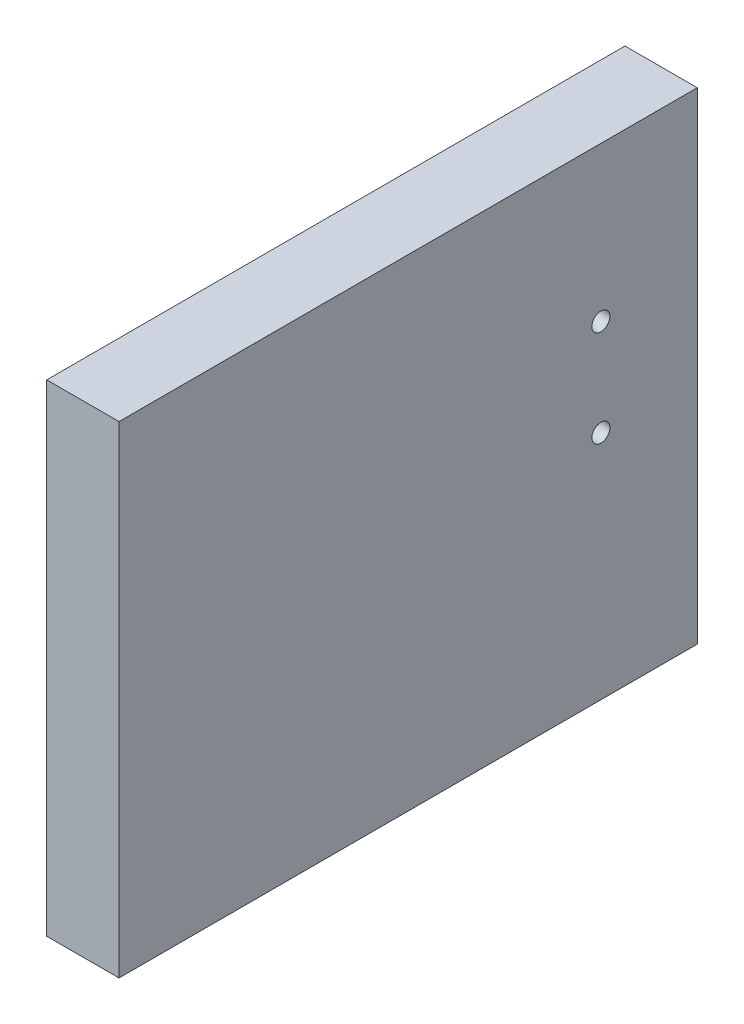
ISO-10303-21;
HEADER;
FILE_DESCRIPTION(('STEP AP214'),'2;1');
FILE_NAME('part.step','',(''),(''),'','','');
FILE_SCHEMA(('AUTOMOTIVE_DESIGN { 1 0 10303 214 1 1 1 1 }'));
ENDSEC;
DATA;
#1=APPLICATION_CONTEXT('core data for automotive mechanical design processes');
#2=APPLICATION_PROTOCOL_DEFINITION('international standard','automotive_design',2000,#1);
#3=PRODUCT_CONTEXT('',#1,'mechanical');
#4=PRODUCT('Part','Part','',(#3));
#5=PRODUCT_RELATED_PRODUCT_CATEGORY('part','',(#4));
#6=PRODUCT_DEFINITION_FORMATION('','',#4);
#7=PRODUCT_DEFINITION_CONTEXT('part definition',#1,'design');
#8=PRODUCT_DEFINITION('design','',#6,#7);
#9=PRODUCT_DEFINITION_SHAPE('','',#8);
#10=(LENGTH_UNIT() NAMED_UNIT(*) SI_UNIT(.MILLI.,.METRE.));
#11=(NAMED_UNIT(*) PLANE_ANGLE_UNIT() SI_UNIT($,.RADIAN.));
#12=(NAMED_UNIT(*) SI_UNIT($,.STERADIAN.) SOLID_ANGLE_UNIT());
#13=UNCERTAINTY_MEASURE_WITH_UNIT(LENGTH_MEASURE(1.E-05),#10,'distance_accuracy_value','');
#14=(GEOMETRIC_REPRESENTATION_CONTEXT(3) GLOBAL_UNCERTAINTY_ASSIGNED_CONTEXT((#13)) GLOBAL_UNIT_ASSIGNED_CONTEXT((#10,
#11,#12)) REPRESENTATION_CONTEXT('',''));
#15=CARTESIAN_POINT('',(0.,0.,0.));
#16=DIRECTION('',(0.,0.,1.));
#17=DIRECTION('',(1.,0.,0.));
#18=AXIS2_PLACEMENT_3D('',#15,#16,#17);
#19=CARTESIAN_POINT('',(9.52499999999999,63.5,152.4));
#20=DIRECTION('',(-1.,0.,0.));
#21=DIRECTION('',(0.,-1.,0.));
#22=AXIS2_PLACEMENT_3D('',#19,#20,#21);
#23=PLANE('',#22);
#24=CARTESIAN_POINT('',(9.525,-2.54,25.4));
#25=DIRECTION('',(1.,0.,0.));
#26=DIRECTION('',(0.,1.,0.));
#27=AXIS2_PLACEMENT_3D('',#24,#25,#26);
#28=CIRCLE('',#27,2.38125);
#29=CARTESIAN_POINT('',(9.525,-0.158750000000003,25.4));
#30=VERTEX_POINT('',#29);
#31=EDGE_CURVE('E117',#30,#30,#28,.T.);
#32=ORIENTED_EDGE('',*,*,#31,.F.);
#33=EDGE_LOOP('',(#32));
#34=FACE_BOUND('',#33,.T.);
#35=CARTESIAN_POINT('',(9.525,22.86,25.4));
#36=DIRECTION('',(1.,0.,0.));
#37=DIRECTION('',(0.,1.,0.));
#38=AXIS2_PLACEMENT_3D('',#35,#36,#37);
#39=CIRCLE('',#38,2.38125000000001);
#40=CARTESIAN_POINT('',(9.525,25.24125,25.4));
#41=VERTEX_POINT('',#40);
#42=EDGE_CURVE('E111',#41,#41,#39,.T.);
#43=ORIENTED_EDGE('',*,*,#42,.F.);
#44=EDGE_LOOP('',(#43));
#45=FACE_BOUND('',#44,.T.);
#46=DIRECTION('',(0.,1.,0.));
#47=VECTOR('',#46,1.);
#48=CARTESIAN_POINT('',(9.52499999999999,63.5,0.));
#49=LINE('',#48,#47);
#50=CARTESIAN_POINT('',(9.52500000000001,-63.5,0.));
#51=VERTEX_POINT('',#50);
#52=CARTESIAN_POINT('',(9.52499999999999,63.5,0.));
#53=VERTEX_POINT('',#52);
#54=EDGE_CURVE('E97',#51,#53,#49,.T.);
#55=ORIENTED_EDGE('',*,*,#54,.T.);
#56=DIRECTION('',(0.,0.,-1.));
#57=VECTOR('',#56,1.);
#58=CARTESIAN_POINT('',(9.52499999999999,63.5,152.4));
#59=LINE('',#58,#57);
#60=CARTESIAN_POINT('',(9.52499999999999,63.5,152.4));
#61=VERTEX_POINT('',#60);
#62=EDGE_CURVE('E11',#61,#53,#59,.T.);
#63=ORIENTED_EDGE('',*,*,#62,.F.);
#64=DIRECTION('',(0.,1.,0.));
#65=VECTOR('',#64,1.);
#66=CARTESIAN_POINT('',(9.52499999999999,63.5,152.4));
#67=LINE('',#66,#65);
#68=CARTESIAN_POINT('',(9.52500000000001,-63.5,152.4));
#69=VERTEX_POINT('',#68);
#70=EDGE_CURVE('E85',#69,#61,#67,.T.);
#71=ORIENTED_EDGE('',*,*,#70,.F.);
#72=DIRECTION('',(0.,0.,-1.));
#73=VECTOR('',#72,1.);
#74=CARTESIAN_POINT('',(9.52500000000001,-63.5,152.4));
#75=LINE('',#74,#73);
#76=EDGE_CURVE('E93',#69,#51,#75,.T.);
#77=ORIENTED_EDGE('',*,*,#76,.T.);
#78=EDGE_LOOP('',(#55,#63,#71,#77));
#79=FACE_BOUND('',#78,.T.);
#80=ADVANCED_FACE('F34',(#34,#45,#79),#23,.F.);
#81=CARTESIAN_POINT('',(-9.52500000000001,63.5,152.4));
#82=DIRECTION('',(0.,-1.,0.));
#83=DIRECTION('',(0.,0.,-1.));
#84=AXIS2_PLACEMENT_3D('',#81,#82,#83);
#85=PLANE('',#84);
#86=DIRECTION('',(-1.,0.,0.));
#87=VECTOR('',#86,1.);
#88=CARTESIAN_POINT('',(-9.52500000000001,63.5,0.));
#89=LINE('',#88,#87);
#90=CARTESIAN_POINT('',(-9.52500000000001,63.5,0.));
#91=VERTEX_POINT('',#90);
#92=EDGE_CURVE('E89',#53,#91,#89,.T.);
#93=ORIENTED_EDGE('',*,*,#92,.T.);
#94=DIRECTION('',(0.,0.,-1.));
#95=VECTOR('',#94,1.);
#96=CARTESIAN_POINT('',(-9.52500000000001,63.5,152.4));
#97=LINE('',#96,#95);
#98=CARTESIAN_POINT('',(-9.52500000000001,63.5,152.4));
#99=VERTEX_POINT('',#98);
#100=EDGE_CURVE('E42',#99,#91,#97,.T.);
#101=ORIENTED_EDGE('',*,*,#100,.F.);
#102=DIRECTION('',(-1.,0.,0.));
#103=VECTOR('',#102,1.);
#104=CARTESIAN_POINT('',(-9.52500000000001,63.5,152.4));
#105=LINE('',#104,#103);
#106=EDGE_CURVE('E80',#61,#99,#105,.T.);
#107=ORIENTED_EDGE('',*,*,#106,.F.);
#108=ORIENTED_EDGE('',*,*,#62,.T.);
#109=EDGE_LOOP('',(#93,#101,#107,#108));
#110=FACE_BOUND('',#109,.T.);
#111=ADVANCED_FACE('F88',(#110),#85,.F.);
#112=CARTESIAN_POINT('',(-9.52500000000001,63.5,152.4));
#113=DIRECTION('',(1.,0.,0.));
#114=DIRECTION('',(0.,1.,0.));
#115=AXIS2_PLACEMENT_3D('',#112,#113,#114);
#116=PLANE('',#115);
#117=CARTESIAN_POINT('',(-9.52500000000002,-2.54,25.4));
#118=DIRECTION('',(1.,0.,0.));
#119=DIRECTION('',(0.,1.,0.));
#120=AXIS2_PLACEMENT_3D('',#117,#118,#119);
#121=CIRCLE('',#120,2.38125);
#122=CARTESIAN_POINT('',(-9.52500000000002,-0.158750000000005,25.4));
#123=VERTEX_POINT('',#122);
#124=EDGE_CURVE('E114',#123,#123,#121,.T.);
#125=ORIENTED_EDGE('',*,*,#124,.T.);
#126=EDGE_LOOP('',(#125));
#127=FACE_BOUND('',#126,.T.);
#128=CARTESIAN_POINT('',(-9.52500000000002,22.86,25.4));
#129=DIRECTION('',(1.,0.,0.));
#130=DIRECTION('',(0.,1.,0.));
#131=AXIS2_PLACEMENT_3D('',#128,#129,#130);
#132=CIRCLE('',#131,2.38125000000001);
#133=CARTESIAN_POINT('',(-9.52500000000002,25.24125,25.4));
#134=VERTEX_POINT('',#133);
#135=EDGE_CURVE('E100',#134,#134,#132,.T.);
#136=ORIENTED_EDGE('',*,*,#135,.T.);
#137=EDGE_LOOP('',(#136));
#138=FACE_BOUND('',#137,.T.);
#139=DIRECTION('',(0.,-1.,0.));
#140=VECTOR('',#139,1.);
#141=CARTESIAN_POINT('',(-9.52500000000001,63.5,0.));
#142=LINE('',#141,#140);
#143=CARTESIAN_POINT('',(-9.525,-63.5,0.));
#144=VERTEX_POINT('',#143);
#145=EDGE_CURVE('E67',#91,#144,#142,.T.);
#146=ORIENTED_EDGE('',*,*,#145,.T.);
#147=DIRECTION('',(0.,0.,-1.));
#148=VECTOR('',#147,1.);
#149=CARTESIAN_POINT('',(-9.525,-63.5,152.4));
#150=LINE('',#149,#148);
#151=CARTESIAN_POINT('',(-9.525,-63.5,152.4));
#152=VERTEX_POINT('',#151);
#153=EDGE_CURVE('E90',#152,#144,#150,.T.);
#154=ORIENTED_EDGE('',*,*,#153,.F.);
#155=DIRECTION('',(0.,-1.,0.));
#156=VECTOR('',#155,1.);
#157=CARTESIAN_POINT('',(-9.52500000000001,63.5,152.4));
#158=LINE('',#157,#156);
#159=EDGE_CURVE('E83',#99,#152,#158,.T.);
#160=ORIENTED_EDGE('',*,*,#159,.F.);
#161=ORIENTED_EDGE('',*,*,#100,.T.);
#162=EDGE_LOOP('',(#146,#154,#160,#161));
#163=FACE_BOUND('',#162,.T.);
#164=ADVANCED_FACE('F91',(#127,#138,#163),#116,.F.);
#165=CARTESIAN_POINT('',(-9.525,-63.5,152.4));
#166=DIRECTION('',(0.,1.,0.));
#167=DIRECTION('',(0.,0.,1.));
#168=AXIS2_PLACEMENT_3D('',#165,#166,#167);
#169=PLANE('',#168);
#170=DIRECTION('',(1.,0.,0.));
#171=VECTOR('',#170,1.);
#172=CARTESIAN_POINT('',(-9.525,-63.5,0.));
#173=LINE('',#172,#171);
#174=EDGE_CURVE('E73',#144,#51,#173,.T.);
#175=ORIENTED_EDGE('',*,*,#174,.T.);
#176=ORIENTED_EDGE('',*,*,#76,.F.);
#177=DIRECTION('',(1.,0.,0.));
#178=VECTOR('',#177,1.);
#179=CARTESIAN_POINT('',(-9.525,-63.5,152.4));
#180=LINE('',#179,#178);
#181=EDGE_CURVE('E50',#152,#69,#180,.T.);
#182=ORIENTED_EDGE('',*,*,#181,.F.);
#183=ORIENTED_EDGE('',*,*,#153,.T.);
#184=EDGE_LOOP('',(#175,#176,#182,#183));
#185=FACE_BOUND('',#184,.T.);
#186=ADVANCED_FACE('F105',(#185),#169,.F.);
#187=CARTESIAN_POINT('',(0.,0.,152.4));
#188=DIRECTION('',(0.,0.,1.));
#189=DIRECTION('',(1.,0.,0.));
#190=AXIS2_PLACEMENT_3D('',#187,#188,#189);
#191=PLANE('',#190);
#192=ORIENTED_EDGE('',*,*,#70,.T.);
#193=ORIENTED_EDGE('',*,*,#106,.T.);
#194=ORIENTED_EDGE('',*,*,#159,.T.);
#195=ORIENTED_EDGE('',*,*,#181,.T.);
#196=EDGE_LOOP('',(#192,#193,#194,#195));
#197=FACE_BOUND('',#196,.T.);
#198=ADVANCED_FACE('F81',(#197),#191,.T.);
#199=CARTESIAN_POINT('',(0.,0.,0.));
#200=DIRECTION('',(0.,0.,1.));
#201=DIRECTION('',(1.,0.,0.));
#202=AXIS2_PLACEMENT_3D('',#199,#200,#201);
#203=PLANE('',#202);
#204=ORIENTED_EDGE('',*,*,#54,.F.);
#205=ORIENTED_EDGE('',*,*,#174,.F.);
#206=ORIENTED_EDGE('',*,*,#145,.F.);
#207=ORIENTED_EDGE('',*,*,#92,.F.);
#208=EDGE_LOOP('',(#204,#205,#206,#207));
#209=FACE_BOUND('',#208,.T.);
#210=ADVANCED_FACE('F108',(#209),#203,.F.);
#211=CARTESIAN_POINT('',(-9.52500000000002,22.86,25.4));
#212=DIRECTION('',(1.,0.,0.));
#213=DIRECTION('',(0.,1.,0.));
#214=AXIS2_PLACEMENT_3D('',#211,#212,#213);
#215=CYLINDRICAL_SURFACE('',#214,2.38125000000001);
#216=ORIENTED_EDGE('',*,*,#135,.F.);
#217=EDGE_LOOP('',(#216));
#218=FACE_BOUND('',#217,.T.);
#219=ORIENTED_EDGE('',*,*,#42,.T.);
#220=EDGE_LOOP('',(#219));
#221=FACE_BOUND('',#220,.T.);
#222=ADVANCED_FACE('F128',(#218,#221),#215,.F.);
#223=CARTESIAN_POINT('',(-9.52500000000002,-2.54,25.4));
#224=DIRECTION('',(1.,0.,0.));
#225=DIRECTION('',(0.,1.,0.));
#226=AXIS2_PLACEMENT_3D('',#223,#224,#225);
#227=CYLINDRICAL_SURFACE('',#226,2.38125);
#228=ORIENTED_EDGE('',*,*,#124,.F.);
#229=EDGE_LOOP('',(#228));
#230=FACE_BOUND('',#229,.T.);
#231=ORIENTED_EDGE('',*,*,#31,.T.);
#232=EDGE_LOOP('',(#231));
#233=FACE_BOUND('',#232,.T.);
#234=ADVANCED_FACE('F125',(#230,#233),#227,.F.);
#235=CLOSED_SHELL('',(#80,#111,#164,#186,#198,#210,#222,#234));
#236=MANIFOLD_SOLID_BREP('B2',#235);
#237=ADVANCED_BREP_SHAPE_REPRESENTATION('',(#18,#236),#14);
#238=SHAPE_DEFINITION_REPRESENTATION(#9,#237);
ENDSEC;
END-ISO-10303-21;
